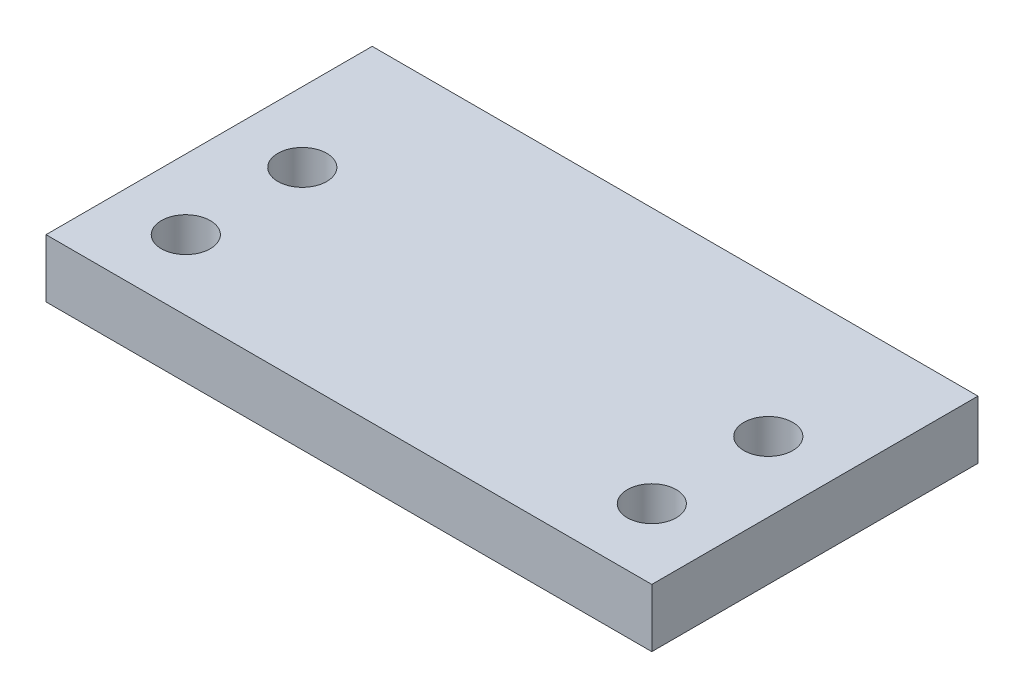
ISO-10303-21;
HEADER;
FILE_DESCRIPTION(('STEP AP214'),'2;1');
FILE_NAME('part.step','',(''),(''),'','','');
FILE_SCHEMA(('AUTOMOTIVE_DESIGN { 1 0 10303 214 1 1 1 1 }'));
ENDSEC;
DATA;
#1=APPLICATION_CONTEXT('core data for automotive mechanical design processes');
#2=APPLICATION_PROTOCOL_DEFINITION('international standard','automotive_design',2000,#1);
#3=PRODUCT_CONTEXT('',#1,'mechanical');
#4=PRODUCT('Part','Part','',(#3));
#5=PRODUCT_RELATED_PRODUCT_CATEGORY('part','',(#4));
#6=PRODUCT_DEFINITION_FORMATION('','',#4);
#7=PRODUCT_DEFINITION_CONTEXT('part definition',#1,'design');
#8=PRODUCT_DEFINITION('design','',#6,#7);
#9=PRODUCT_DEFINITION_SHAPE('','',#8);
#10=(LENGTH_UNIT() NAMED_UNIT(*) SI_UNIT(.MILLI.,.METRE.));
#11=(NAMED_UNIT(*) PLANE_ANGLE_UNIT() SI_UNIT($,.RADIAN.));
#12=(NAMED_UNIT(*) SI_UNIT($,.STERADIAN.) SOLID_ANGLE_UNIT());
#13=UNCERTAINTY_MEASURE_WITH_UNIT(LENGTH_MEASURE(1.E-05),#10,'distance_accuracy_value','');
#14=(GEOMETRIC_REPRESENTATION_CONTEXT(3) GLOBAL_UNCERTAINTY_ASSIGNED_CONTEXT((#13)) GLOBAL_UNIT_ASSIGNED_CONTEXT((#10,
#11,#12)) REPRESENTATION_CONTEXT('',''));
#15=CARTESIAN_POINT('',(0.,0.,0.));
#16=DIRECTION('',(0.,0.,1.));
#17=DIRECTION('',(1.,0.,0.));
#18=AXIS2_PLACEMENT_3D('',#15,#16,#17);
#19=CARTESIAN_POINT('',(0.,5.,0.));
#20=DIRECTION('',(0.,-1.,0.));
#21=DIRECTION('',(0.,0.,-1.));
#22=AXIS2_PLACEMENT_3D('',#19,#20,#21);
#23=PLANE('',#22);
#24=DIRECTION('',(0.,0.,-1.));
#25=VECTOR('',#24,1.);
#26=CARTESIAN_POINT('',(26.,5.,14.));
#27=LINE('',#26,#25);
#28=CARTESIAN_POINT('',(26.,5.,14.));
#29=VERTEX_POINT('',#28);
#30=CARTESIAN_POINT('',(26.,5.,-14.));
#31=VERTEX_POINT('',#30);
#32=EDGE_CURVE('E98',#29,#31,#27,.T.);
#33=ORIENTED_EDGE('',*,*,#32,.T.);
#34=DIRECTION('',(-1.,0.,0.));
#35=VECTOR('',#34,1.);
#36=CARTESIAN_POINT('',(-26.,5.,-14.));
#37=LINE('',#36,#35);
#38=CARTESIAN_POINT('',(-26.,5.,-14.));
#39=VERTEX_POINT('',#38);
#40=EDGE_CURVE('E93',#31,#39,#37,.T.);
#41=ORIENTED_EDGE('',*,*,#40,.T.);
#42=DIRECTION('',(0.,0.,1.));
#43=VECTOR('',#42,1.);
#44=CARTESIAN_POINT('',(-26.,5.,14.));
#45=LINE('',#44,#43);
#46=CARTESIAN_POINT('',(-26.,5.,14.));
#47=VERTEX_POINT('',#46);
#48=EDGE_CURVE('E96',#39,#47,#45,.T.);
#49=ORIENTED_EDGE('',*,*,#48,.T.);
#50=DIRECTION('',(1.,0.,0.));
#51=VECTOR('',#50,1.);
#52=CARTESIAN_POINT('',(-26.,5.,14.));
#53=LINE('',#52,#51);
#54=EDGE_CURVE('E63',#47,#29,#53,.T.);
#55=ORIENTED_EDGE('',*,*,#54,.T.);
#56=EDGE_LOOP('',(#33,#41,#49,#55));
#57=FACE_BOUND('',#56,.T.);
#58=CARTESIAN_POINT('',(20.,5.,8.));
#59=DIRECTION('',(0.,1.,0.));
#60=DIRECTION('',(0.,0.,1.));
#61=AXIS2_PLACEMENT_3D('',#58,#59,#60);
#62=CIRCLE('',#61,2.1);
#63=CARTESIAN_POINT('',(20.,5.,10.1));
#64=VERTEX_POINT('',#63);
#65=EDGE_CURVE('E118',#64,#64,#62,.T.);
#66=ORIENTED_EDGE('',*,*,#65,.F.);
#67=EDGE_LOOP('',(#66));
#68=FACE_BOUND('',#67,.T.);
#69=CARTESIAN_POINT('',(20.,5.,-2.));
#70=DIRECTION('',(0.,1.,0.));
#71=DIRECTION('',(0.,0.,-1.));
#72=AXIS2_PLACEMENT_3D('',#69,#70,#71);
#73=CIRCLE('',#72,2.1);
#74=CARTESIAN_POINT('',(20.,5.,-4.1));
#75=VERTEX_POINT('',#74);
#76=EDGE_CURVE('E140',#75,#75,#73,.T.);
#77=ORIENTED_EDGE('',*,*,#76,.F.);
#78=EDGE_LOOP('',(#77));
#79=FACE_BOUND('',#78,.T.);
#80=CARTESIAN_POINT('',(-20.,5.,8.));
#81=DIRECTION('',(0.,1.,0.));
#82=DIRECTION('',(0.,0.,-1.));
#83=AXIS2_PLACEMENT_3D('',#80,#81,#82);
#84=CIRCLE('',#83,2.1);
#85=CARTESIAN_POINT('',(-20.,5.,5.9));
#86=VERTEX_POINT('',#85);
#87=EDGE_CURVE('E148',#86,#86,#84,.T.);
#88=ORIENTED_EDGE('',*,*,#87,.F.);
#89=EDGE_LOOP('',(#88));
#90=FACE_BOUND('',#89,.T.);
#91=CARTESIAN_POINT('',(-20.,5.,-2.));
#92=DIRECTION('',(0.,1.,0.));
#93=DIRECTION('',(0.,0.,1.));
#94=AXIS2_PLACEMENT_3D('',#91,#92,#93);
#95=CIRCLE('',#94,2.1);
#96=CARTESIAN_POINT('',(-20.,5.,0.100000000000004));
#97=VERTEX_POINT('',#96);
#98=EDGE_CURVE('E156',#97,#97,#95,.T.);
#99=ORIENTED_EDGE('',*,*,#98,.F.);
#100=EDGE_LOOP('',(#99));
#101=FACE_BOUND('',#100,.T.);
#102=ADVANCED_FACE('F45',(#57,#68,#79,#90,#101),#23,.F.);
#103=CARTESIAN_POINT('',(0.,0.,0.));
#104=DIRECTION('',(0.,-1.,0.));
#105=DIRECTION('',(0.,0.,-1.));
#106=AXIS2_PLACEMENT_3D('',#103,#104,#105);
#107=PLANE('',#106);
#108=CARTESIAN_POINT('',(-20.,0.,8.));
#109=DIRECTION('',(0.,1.,0.));
#110=DIRECTION('',(0.,0.,-1.));
#111=AXIS2_PLACEMENT_3D('',#108,#109,#110);
#112=CIRCLE('',#111,2.1);
#113=CARTESIAN_POINT('',(-20.,0.,5.9));
#114=VERTEX_POINT('',#113);
#115=EDGE_CURVE('E152',#114,#114,#112,.T.);
#116=ORIENTED_EDGE('',*,*,#115,.T.);
#117=EDGE_LOOP('',(#116));
#118=FACE_BOUND('',#117,.T.);
#119=CARTESIAN_POINT('',(20.,0.,8.));
#120=DIRECTION('',(0.,1.,0.));
#121=DIRECTION('',(0.,0.,1.));
#122=AXIS2_PLACEMENT_3D('',#119,#120,#121);
#123=CIRCLE('',#122,2.1);
#124=CARTESIAN_POINT('',(20.,0.,10.1));
#125=VERTEX_POINT('',#124);
#126=EDGE_CURVE('E136',#125,#125,#123,.T.);
#127=ORIENTED_EDGE('',*,*,#126,.T.);
#128=EDGE_LOOP('',(#127));
#129=FACE_BOUND('',#128,.T.);
#130=DIRECTION('',(0.,0.,-1.));
#131=VECTOR('',#130,1.);
#132=CARTESIAN_POINT('',(26.,0.,14.));
#133=LINE('',#132,#131);
#134=CARTESIAN_POINT('',(26.,0.,14.));
#135=VERTEX_POINT('',#134);
#136=CARTESIAN_POINT('',(26.,0.,-14.));
#137=VERTEX_POINT('',#136);
#138=EDGE_CURVE('E114',#135,#137,#133,.T.);
#139=ORIENTED_EDGE('',*,*,#138,.F.);
#140=DIRECTION('',(1.,0.,0.));
#141=VECTOR('',#140,1.);
#142=CARTESIAN_POINT('',(-26.,0.,14.));
#143=LINE('',#142,#141);
#144=CARTESIAN_POINT('',(-26.,0.,14.));
#145=VERTEX_POINT('',#144);
#146=EDGE_CURVE('E86',#145,#135,#143,.T.);
#147=ORIENTED_EDGE('',*,*,#146,.F.);
#148=DIRECTION('',(0.,0.,1.));
#149=VECTOR('',#148,1.);
#150=CARTESIAN_POINT('',(-26.,0.,14.));
#151=LINE('',#150,#149);
#152=CARTESIAN_POINT('',(-26.,0.,-14.));
#153=VERTEX_POINT('',#152);
#154=EDGE_CURVE('E80',#153,#145,#151,.T.);
#155=ORIENTED_EDGE('',*,*,#154,.F.);
#156=DIRECTION('',(-1.,0.,0.));
#157=VECTOR('',#156,1.);
#158=CARTESIAN_POINT('',(-26.,0.,-14.));
#159=LINE('',#158,#157);
#160=EDGE_CURVE('E103',#137,#153,#159,.T.);
#161=ORIENTED_EDGE('',*,*,#160,.F.);
#162=EDGE_LOOP('',(#139,#147,#155,#161));
#163=FACE_BOUND('',#162,.T.);
#164=CARTESIAN_POINT('',(20.,0.,-2.));
#165=DIRECTION('',(0.,1.,0.));
#166=DIRECTION('',(0.,0.,-1.));
#167=AXIS2_PLACEMENT_3D('',#164,#165,#166);
#168=CIRCLE('',#167,2.1);
#169=CARTESIAN_POINT('',(20.,0.,-4.1));
#170=VERTEX_POINT('',#169);
#171=EDGE_CURVE('E144',#170,#170,#168,.T.);
#172=ORIENTED_EDGE('',*,*,#171,.T.);
#173=EDGE_LOOP('',(#172));
#174=FACE_BOUND('',#173,.T.);
#175=CARTESIAN_POINT('',(-20.,0.,-2.));
#176=DIRECTION('',(0.,1.,0.));
#177=DIRECTION('',(0.,0.,1.));
#178=AXIS2_PLACEMENT_3D('',#175,#176,#177);
#179=CIRCLE('',#178,2.1);
#180=CARTESIAN_POINT('',(-20.,0.,0.100000000000004));
#181=VERTEX_POINT('',#180);
#182=EDGE_CURVE('E160',#181,#181,#179,.T.);
#183=ORIENTED_EDGE('',*,*,#182,.T.);
#184=EDGE_LOOP('',(#183));
#185=FACE_BOUND('',#184,.T.);
#186=ADVANCED_FACE('F131',(#118,#129,#163,#174,#185),#107,.T.);
#187=CARTESIAN_POINT('',(26.,5.,14.));
#188=DIRECTION('',(-1.,0.,0.));
#189=DIRECTION('',(0.,0.,1.));
#190=AXIS2_PLACEMENT_3D('',#187,#188,#189);
#191=PLANE('',#190);
#192=ORIENTED_EDGE('',*,*,#138,.T.);
#193=DIRECTION('',(0.,-1.,0.));
#194=VECTOR('',#193,1.);
#195=CARTESIAN_POINT('',(26.,5.,-14.));
#196=LINE('',#195,#194);
#197=EDGE_CURVE('E11',#31,#137,#196,.T.);
#198=ORIENTED_EDGE('',*,*,#197,.F.);
#199=ORIENTED_EDGE('',*,*,#32,.F.);
#200=DIRECTION('',(0.,-1.,0.));
#201=VECTOR('',#200,1.);
#202=CARTESIAN_POINT('',(26.,5.,14.));
#203=LINE('',#202,#201);
#204=EDGE_CURVE('E110',#29,#135,#203,.T.);
#205=ORIENTED_EDGE('',*,*,#204,.T.);
#206=EDGE_LOOP('',(#192,#198,#199,#205));
#207=FACE_BOUND('',#206,.T.);
#208=ADVANCED_FACE('F47',(#207),#191,.F.);
#209=CARTESIAN_POINT('',(-26.,5.,-14.));
#210=DIRECTION('',(0.,0.,1.));
#211=DIRECTION('',(1.,0.,0.));
#212=AXIS2_PLACEMENT_3D('',#209,#210,#211);
#213=PLANE('',#212);
#214=ORIENTED_EDGE('',*,*,#160,.T.);
#215=DIRECTION('',(0.,-1.,0.));
#216=VECTOR('',#215,1.);
#217=CARTESIAN_POINT('',(-26.,5.,-14.));
#218=LINE('',#217,#216);
#219=EDGE_CURVE('E55',#39,#153,#218,.T.);
#220=ORIENTED_EDGE('',*,*,#219,.F.);
#221=ORIENTED_EDGE('',*,*,#40,.F.);
#222=ORIENTED_EDGE('',*,*,#197,.T.);
#223=EDGE_LOOP('',(#214,#220,#221,#222));
#224=FACE_BOUND('',#223,.T.);
#225=ADVANCED_FACE('F102',(#224),#213,.F.);
#226=CARTESIAN_POINT('',(-26.,5.,14.));
#227=DIRECTION('',(1.,0.,0.));
#228=DIRECTION('',(0.,0.,-1.));
#229=AXIS2_PLACEMENT_3D('',#226,#227,#228);
#230=PLANE('',#229);
#231=ORIENTED_EDGE('',*,*,#154,.T.);
#232=DIRECTION('',(0.,-1.,0.));
#233=VECTOR('',#232,1.);
#234=CARTESIAN_POINT('',(-26.,5.,14.));
#235=LINE('',#234,#233);
#236=EDGE_CURVE('E105',#47,#145,#235,.T.);
#237=ORIENTED_EDGE('',*,*,#236,.F.);
#238=ORIENTED_EDGE('',*,*,#48,.F.);
#239=ORIENTED_EDGE('',*,*,#219,.T.);
#240=EDGE_LOOP('',(#231,#237,#238,#239));
#241=FACE_BOUND('',#240,.T.);
#242=ADVANCED_FACE('F106',(#241),#230,.F.);
#243=CARTESIAN_POINT('',(-26.,5.,14.));
#244=DIRECTION('',(0.,0.,-1.));
#245=DIRECTION('',(-1.,0.,0.));
#246=AXIS2_PLACEMENT_3D('',#243,#244,#245);
#247=PLANE('',#246);
#248=ORIENTED_EDGE('',*,*,#146,.T.);
#249=ORIENTED_EDGE('',*,*,#204,.F.);
#250=ORIENTED_EDGE('',*,*,#54,.F.);
#251=ORIENTED_EDGE('',*,*,#236,.T.);
#252=EDGE_LOOP('',(#248,#249,#250,#251));
#253=FACE_BOUND('',#252,.T.);
#254=ADVANCED_FACE('F128',(#253),#247,.F.);
#255=CARTESIAN_POINT('',(20.,5.,8.));
#256=DIRECTION('',(0.,-1.,0.));
#257=DIRECTION('',(0.,0.,-1.));
#258=AXIS2_PLACEMENT_3D('',#255,#256,#257);
#259=CYLINDRICAL_SURFACE('',#258,2.1);
#260=ORIENTED_EDGE('',*,*,#65,.T.);
#261=EDGE_LOOP('',(#260));
#262=FACE_BOUND('',#261,.T.);
#263=ORIENTED_EDGE('',*,*,#126,.F.);
#264=EDGE_LOOP('',(#263));
#265=FACE_BOUND('',#264,.T.);
#266=ADVANCED_FACE('F179',(#262,#265),#259,.F.);
#267=CARTESIAN_POINT('',(20.,5.,-2.));
#268=DIRECTION('',(0.,-1.,0.));
#269=DIRECTION('',(0.,0.,-1.));
#270=AXIS2_PLACEMENT_3D('',#267,#268,#269);
#271=CYLINDRICAL_SURFACE('',#270,2.1);
#272=ORIENTED_EDGE('',*,*,#76,.T.);
#273=EDGE_LOOP('',(#272));
#274=FACE_BOUND('',#273,.T.);
#275=ORIENTED_EDGE('',*,*,#171,.F.);
#276=EDGE_LOOP('',(#275));
#277=FACE_BOUND('',#276,.T.);
#278=ADVANCED_FACE('F224',(#274,#277),#271,.F.);
#279=CARTESIAN_POINT('',(-20.,5.,8.));
#280=DIRECTION('',(0.,-1.,0.));
#281=DIRECTION('',(0.,0.,-1.));
#282=AXIS2_PLACEMENT_3D('',#279,#280,#281);
#283=CYLINDRICAL_SURFACE('',#282,2.1);
#284=ORIENTED_EDGE('',*,*,#87,.T.);
#285=EDGE_LOOP('',(#284));
#286=FACE_BOUND('',#285,.T.);
#287=ORIENTED_EDGE('',*,*,#115,.F.);
#288=EDGE_LOOP('',(#287));
#289=FACE_BOUND('',#288,.T.);
#290=ADVANCED_FACE('F232',(#286,#289),#283,.F.);
#291=CARTESIAN_POINT('',(-20.,5.,-2.));
#292=DIRECTION('',(0.,-1.,0.));
#293=DIRECTION('',(0.,0.,-1.));
#294=AXIS2_PLACEMENT_3D('',#291,#292,#293);
#295=CYLINDRICAL_SURFACE('',#294,2.1);
#296=ORIENTED_EDGE('',*,*,#98,.T.);
#297=EDGE_LOOP('',(#296));
#298=FACE_BOUND('',#297,.T.);
#299=ORIENTED_EDGE('',*,*,#182,.F.);
#300=EDGE_LOOP('',(#299));
#301=FACE_BOUND('',#300,.T.);
#302=ADVANCED_FACE('F168',(#298,#301),#295,.F.);
#303=CLOSED_SHELL('',(#102,#186,#208,#225,#242,#254,#266,#278,#290,#302));
#304=MANIFOLD_SOLID_BREP('B2',#303);
#305=ADVANCED_BREP_SHAPE_REPRESENTATION('',(#18,#304),#14);
#306=SHAPE_DEFINITION_REPRESENTATION(#9,#305);
ENDSEC;
END-ISO-10303-21;
